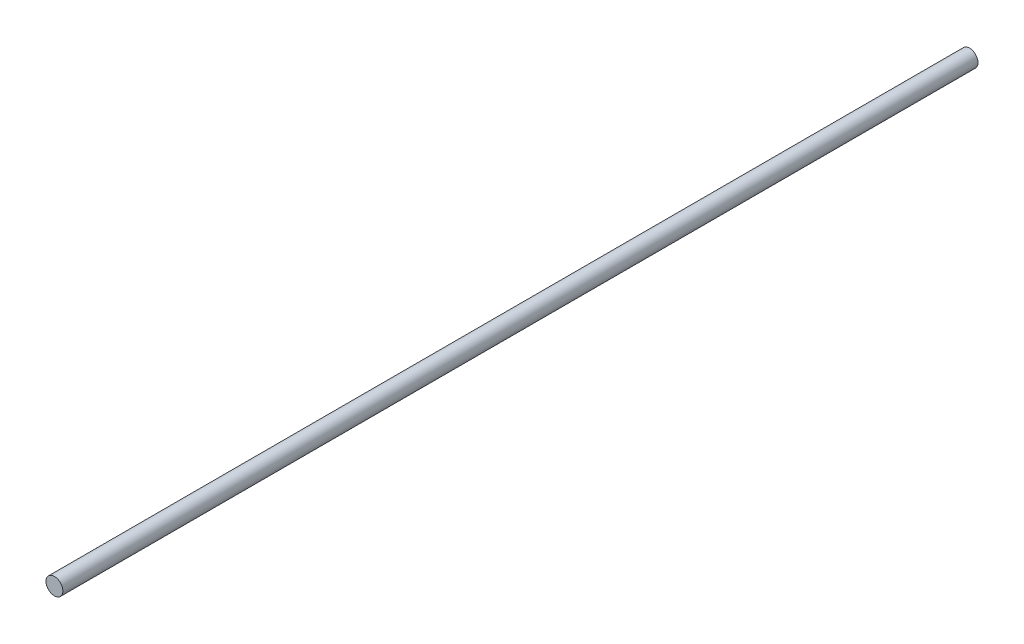
ISO-10303-21;
HEADER;
FILE_DESCRIPTION(('STEP AP214'),'2;1');
FILE_NAME('part.step','',(''),(''),'','','');
FILE_SCHEMA(('AUTOMOTIVE_DESIGN { 1 0 10303 214 1 1 1 1 }'));
ENDSEC;
DATA;
#1=APPLICATION_CONTEXT('core data for automotive mechanical design processes');
#2=APPLICATION_PROTOCOL_DEFINITION('international standard','automotive_design',2000,#1);
#3=PRODUCT_CONTEXT('',#1,'mechanical');
#4=PRODUCT('Part','Part','',(#3));
#5=PRODUCT_RELATED_PRODUCT_CATEGORY('part','',(#4));
#6=PRODUCT_DEFINITION_FORMATION('','',#4);
#7=PRODUCT_DEFINITION_CONTEXT('part definition',#1,'design');
#8=PRODUCT_DEFINITION('design','',#6,#7);
#9=PRODUCT_DEFINITION_SHAPE('','',#8);
#10=(LENGTH_UNIT() NAMED_UNIT(*) SI_UNIT(.MILLI.,.METRE.));
#11=(NAMED_UNIT(*) PLANE_ANGLE_UNIT() SI_UNIT($,.RADIAN.));
#12=(NAMED_UNIT(*) SI_UNIT($,.STERADIAN.) SOLID_ANGLE_UNIT());
#13=UNCERTAINTY_MEASURE_WITH_UNIT(LENGTH_MEASURE(1.E-05),#10,'distance_accuracy_value','');
#14=(GEOMETRIC_REPRESENTATION_CONTEXT(3) GLOBAL_UNCERTAINTY_ASSIGNED_CONTEXT((#13)) GLOBAL_UNIT_ASSIGNED_CONTEXT((#10,
#11,#12)) REPRESENTATION_CONTEXT('',''));
#15=CARTESIAN_POINT('',(0.,0.,0.));
#16=DIRECTION('',(0.,0.,1.));
#17=DIRECTION('',(1.,0.,0.));
#18=AXIS2_PLACEMENT_3D('',#15,#16,#17);
#19=CARTESIAN_POINT('',(0.,0.,40920.));
#20=DIRECTION('',(0.,0.,-1.));
#21=DIRECTION('',(-1.,0.,0.));
#22=AXIS2_PLACEMENT_3D('',#19,#20,#21);
#23=CYLINDRICAL_SURFACE('',#22,28.575);
#24=CARTESIAN_POINT('',(0.,0.,40920.));
#25=DIRECTION('',(0.,0.,1.));
#26=DIRECTION('',(1.,0.,0.));
#27=AXIS2_PLACEMENT_3D('',#24,#25,#26);
#28=CIRCLE('',#27,28.575);
#29=CARTESIAN_POINT('',(28.575,0.,40920.));
#30=VERTEX_POINT('',#29);
#31=EDGE_CURVE('E10',#30,#30,#28,.T.);
#32=ORIENTED_EDGE('',*,*,#31,.F.);
#33=EDGE_LOOP('',(#32));
#34=FACE_BOUND('',#33,.T.);
#35=CARTESIAN_POINT('',(0.,0.,37820.));
#36=DIRECTION('',(0.,0.,1.));
#37=DIRECTION('',(1.,0.,0.));
#38=AXIS2_PLACEMENT_3D('',#35,#36,#37);
#39=CIRCLE('',#38,28.575);
#40=CARTESIAN_POINT('',(28.575,0.,37820.));
#41=VERTEX_POINT('',#40);
#42=EDGE_CURVE('E39',#41,#41,#39,.T.);
#43=ORIENTED_EDGE('',*,*,#42,.T.);
#44=EDGE_LOOP('',(#43));
#45=FACE_BOUND('',#44,.T.);
#46=ADVANCED_FACE('F36',(#34,#45),#23,.T.);
#47=CARTESIAN_POINT('',(0.,0.,40920.));
#48=DIRECTION('',(0.,0.,1.));
#49=DIRECTION('',(1.,0.,0.));
#50=AXIS2_PLACEMENT_3D('',#47,#48,#49);
#51=PLANE('',#50);
#52=ORIENTED_EDGE('',*,*,#31,.T.);
#53=EDGE_LOOP('',(#52));
#54=FACE_BOUND('',#53,.T.);
#55=ADVANCED_FACE('F53',(#54),#51,.T.);
#56=CARTESIAN_POINT('',(0.,0.,37820.));
#57=DIRECTION('',(0.,0.,1.));
#58=DIRECTION('',(1.,0.,0.));
#59=AXIS2_PLACEMENT_3D('',#56,#57,#58);
#60=PLANE('',#59);
#61=ORIENTED_EDGE('',*,*,#42,.F.);
#62=EDGE_LOOP('',(#61));
#63=FACE_BOUND('',#62,.T.);
#64=ADVANCED_FACE('F51',(#63),#60,.F.);
#65=CLOSED_SHELL('',(#46,#55,#64));
#66=MANIFOLD_SOLID_BREP('B2',#65);
#67=ADVANCED_BREP_SHAPE_REPRESENTATION('',(#18,#66),#14);
#68=SHAPE_DEFINITION_REPRESENTATION(#9,#67);
ENDSEC;
END-ISO-10303-21;
